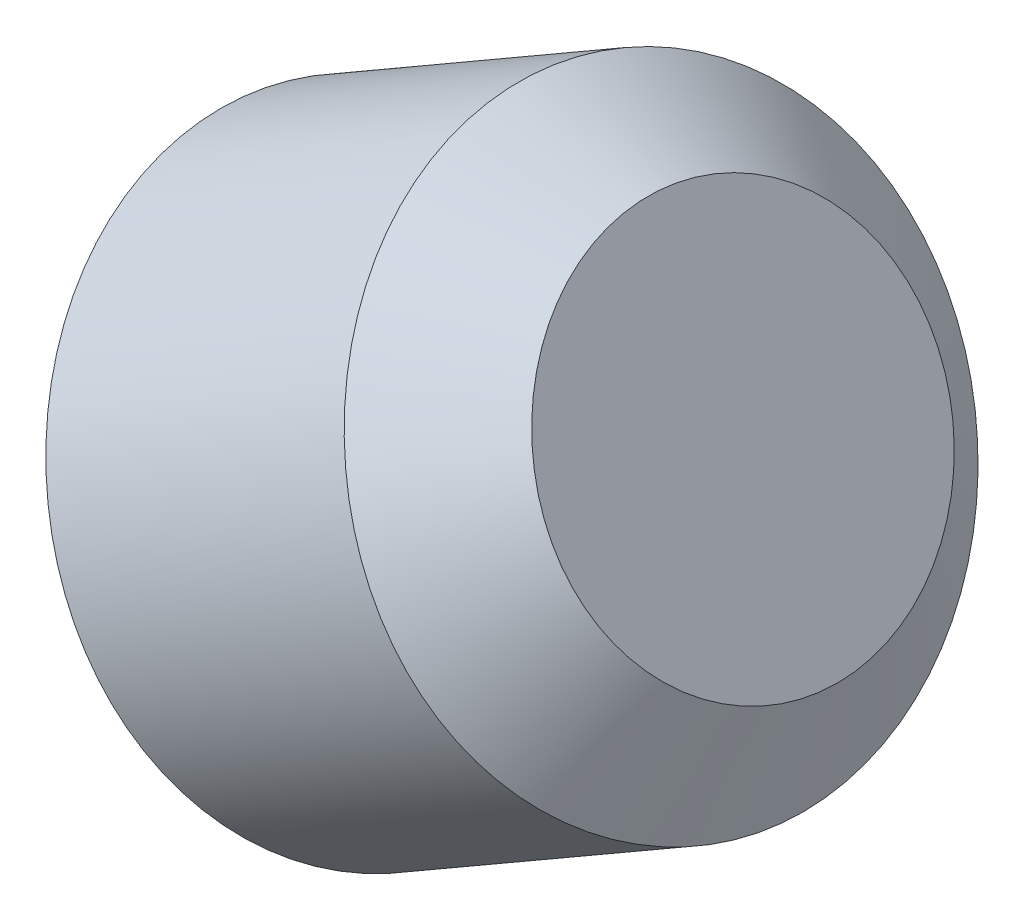
ISO-10303-21;
HEADER;
FILE_DESCRIPTION(('STEP AP214'),'2;1');
FILE_NAME('part.step','',(''),(''),'','','');
FILE_SCHEMA(('AUTOMOTIVE_DESIGN { 1 0 10303 214 1 1 1 1 }'));
ENDSEC;
DATA;
#1=APPLICATION_CONTEXT('core data for automotive mechanical design processes');
#2=APPLICATION_PROTOCOL_DEFINITION('international standard','automotive_design',2000,#1);
#3=PRODUCT_CONTEXT('',#1,'mechanical');
#4=PRODUCT('Part','Part','',(#3));
#5=PRODUCT_RELATED_PRODUCT_CATEGORY('part','',(#4));
#6=PRODUCT_DEFINITION_FORMATION('','',#4);
#7=PRODUCT_DEFINITION_CONTEXT('part definition',#1,'design');
#8=PRODUCT_DEFINITION('design','',#6,#7);
#9=PRODUCT_DEFINITION_SHAPE('','',#8);
#10=(LENGTH_UNIT() NAMED_UNIT(*) SI_UNIT(.MILLI.,.METRE.));
#11=(NAMED_UNIT(*) PLANE_ANGLE_UNIT() SI_UNIT($,.RADIAN.));
#12=(NAMED_UNIT(*) SI_UNIT($,.STERADIAN.) SOLID_ANGLE_UNIT());
#13=UNCERTAINTY_MEASURE_WITH_UNIT(LENGTH_MEASURE(1.E-05),#10,'distance_accuracy_value','');
#14=(GEOMETRIC_REPRESENTATION_CONTEXT(3) GLOBAL_UNCERTAINTY_ASSIGNED_CONTEXT((#13)) GLOBAL_UNIT_ASSIGNED_CONTEXT((#10,
#11,#12)) REPRESENTATION_CONTEXT('',''));
#15=CARTESIAN_POINT('',(0.,0.,0.));
#16=DIRECTION('',(0.,0.,1.));
#17=DIRECTION('',(1.,0.,0.));
#18=AXIS2_PLACEMENT_3D('',#15,#16,#17);
#19=CARTESIAN_POINT('',(-18.0705080756888,-8.70096189432334,19.0660254037844));
#20=DIRECTION('',(-0.5,0.866025403784439,0.));
#21=DIRECTION('',(-0.866025403784439,-0.5,0.));
#22=AXIS2_PLACEMENT_3D('',#19,#20,#21);
#23=PLANE('',#22);
#24=DIRECTION('',(0.866025403784441,0.5,0.));
#25=VECTOR('',#24,1.);
#26=CARTESIAN_POINT('',(-18.0705080756888,-8.70096189432334,17.3339745962156));
#27=LINE('',#26,#25);
#28=CARTESIAN_POINT('',(-18.0705080756938,-8.70096189432089,17.333974596213));
#29=VERTEX_POINT('',#28);
#30=CARTESIAN_POINT('',(-16.3384572681199,-7.70096189432334,17.3339745962156));
#31=VERTEX_POINT('',#30);
#32=EDGE_CURVE('E75',#29,#31,#27,.T.);
#33=ORIENTED_EDGE('',*,*,#32,.T.);
#34=DIRECTION('',(0.,0.,1.));
#35=VECTOR('',#34,1.);
#36=CARTESIAN_POINT('',(-16.3384572681199,-7.70096189432334,18.2));
#37=LINE('',#36,#35);
#38=CARTESIAN_POINT('',(-16.3384572681199,-7.70096189432332,19.0660254037844));
#39=VERTEX_POINT('',#38);
#40=EDGE_CURVE('E272',#31,#39,#37,.T.);
#41=ORIENTED_EDGE('',*,*,#40,.T.);
#42=DIRECTION('',(-0.866025403784441,-0.5,0.));
#43=VECTOR('',#42,1.);
#44=CARTESIAN_POINT('',(-16.3384572681199,-7.70096189432332,19.0660254037844));
#45=LINE('',#44,#43);
#46=CARTESIAN_POINT('',(-18.0705080756689,-8.70096189430647,19.0660254037871));
#47=VERTEX_POINT('',#46);
#48=EDGE_CURVE('E78',#39,#47,#45,.T.);
#49=ORIENTED_EDGE('',*,*,#48,.T.);
#50=CARTESIAN_POINT('',(-18.0705080756894,-8.70096189432366,17.3339745962134));
#51=CARTESIAN_POINT('',(-18.0527331897658,-8.69069955915088,17.4050666943716));
#52=CARTESIAN_POINT('',(-18.0364597802602,-8.68130410179218,17.4767211941388));
#53=CARTESIAN_POINT('',(-18.0076985481524,-8.66469879669252,17.6211941714046));
#54=CARTESIAN_POINT('',(-17.9952191955697,-8.65749383911956,17.6940148766805));
#55=CARTESIAN_POINT('',(-17.9751508858139,-8.64590739507989,17.838839173771));
#56=CARTESIAN_POINT('',(-17.9674549328141,-8.6414641345438,17.9108223754799));
#57=CARTESIAN_POINT('',(-17.9571235723808,-8.63549932081653,18.0552040758798));
#58=CARTESIAN_POINT('',(-17.9544826719044,-8.63397459621557,18.1276020379399));
#59=CARTESIAN_POINT('',(-17.9544826719044,-8.63397459621557,18.2723979620594));
#60=CARTESIAN_POINT('',(-17.9571235723807,-8.6354993208165,18.3447959241189));
#61=CARTESIAN_POINT('',(-17.9674549328139,-8.64146413454367,18.4891776245176));
#62=CARTESIAN_POINT('',(-17.9751508858135,-8.64590739507968,18.5611608262258));
#63=CARTESIAN_POINT('',(-17.995219195569,-8.65749383911916,18.705985123315));
#64=CARTESIAN_POINT('',(-18.0076985481515,-8.664698796692,18.7788058285904));
#65=CARTESIAN_POINT('',(-18.0364597802588,-8.68130410179139,18.9232788058549));
#66=CARTESIAN_POINT('',(-18.0527331897642,-8.69069955914994,18.9949333056215));
#67=CARTESIAN_POINT('',(-18.0705080756875,-8.70096189432257,19.066025403779));
#68=B_SPLINE_CURVE_WITH_KNOTS('',3,(#50,#51,#52,#53,#54,#55,#56,#57,#58,#59,#60,#61,#62,#63,#64,
#65,#66,#67),.UNSPECIFIED.,.F.,.F.,(4,2,2,2,2,2,2,2,4),(0.,0.222055046938493,0.444602239567093,
0.66197314437882,0.879107709995521,1.09624227561031,1.31361318042012,1.53616037304669,
1.75821541998318),.UNSPECIFIED.);
#69=EDGE_CURVE('E21',#29,#47,#68,.T.);
#70=ORIENTED_EDGE('',*,*,#69,.F.);
#71=EDGE_LOOP('',(#33,#41,#49,#70));
#72=FACE_BOUND('',#71,.T.);
#73=ADVANCED_FACE('F17',(#72),#23,.F.);
#74=CARTESIAN_POINT('',(-16.5705080756888,-11.2990381056767,17.3339745962156));
#75=DIRECTION('',(0.5,-0.866025403784439,0.));
#76=DIRECTION('',(0.866025403784439,0.5,0.));
#77=AXIS2_PLACEMENT_3D('',#74,#75,#76);
#78=PLANE('',#77);
#79=DIRECTION('',(0.866025403784441,0.5,0.));
#80=VECTOR('',#79,1.);
#81=CARTESIAN_POINT('',(-16.5705080756888,-11.2990381056767,19.0660254037844));
#82=LINE('',#81,#80);
#83=CARTESIAN_POINT('',(-16.5705080756871,-11.2990381056863,19.0660254037802));
#84=VERTEX_POINT('',#83);
#85=CARTESIAN_POINT('',(-14.8384572681199,-10.2990381056767,19.0660254037844));
#86=VERTEX_POINT('',#85);
#87=EDGE_CURVE('E235',#84,#86,#82,.T.);
#88=ORIENTED_EDGE('',*,*,#87,.T.);
#89=DIRECTION('',(0.,0.,1.));
#90=VECTOR('',#89,1.);
#91=CARTESIAN_POINT('',(-14.8384572681199,-10.2990381056767,18.2));
#92=LINE('',#91,#90);
#93=CARTESIAN_POINT('',(-14.8384572681199,-10.2990381056767,17.3339745962156));
#94=VERTEX_POINT('',#93);
#95=EDGE_CURVE('E172',#86,#94,#92,.F.);
#96=ORIENTED_EDGE('',*,*,#95,.T.);
#97=DIRECTION('',(-0.866025403784441,-0.5,0.));
#98=VECTOR('',#97,1.);
#99=CARTESIAN_POINT('',(-14.8384572681199,-10.2990381056767,17.3339745962156));
#100=LINE('',#99,#98);
#101=CARTESIAN_POINT('',(-16.5705080756944,-11.2990381056853,17.333974596213));
#102=VERTEX_POINT('',#101);
#103=EDGE_CURVE('E90',#94,#102,#100,.T.);
#104=ORIENTED_EDGE('',*,*,#103,.T.);
#105=CARTESIAN_POINT('',(-16.5705080756893,-11.299038105677,19.0660254037866));
#106=CARTESIAN_POINT('',(-16.5527331897658,-11.2887757705042,18.9949333056284));
#107=CARTESIAN_POINT('',(-16.5364597802602,-11.2793803131456,18.9232788058612));
#108=CARTESIAN_POINT('',(-16.5076985481524,-11.2627750080459,18.7788058285954));
#109=CARTESIAN_POINT('',(-16.4952191955697,-11.2555700504729,18.7059851233195));
#110=CARTESIAN_POINT('',(-16.4751508858139,-11.2439836064333,18.561160826229));
#111=CARTESIAN_POINT('',(-16.4674549328141,-11.2395403458972,18.4891776245201));
#112=CARTESIAN_POINT('',(-16.4571235723808,-11.2335755321699,18.3447959241202));
#113=CARTESIAN_POINT('',(-16.4544826719044,-11.2320508075689,18.2723979620601));
#114=CARTESIAN_POINT('',(-16.4544826719044,-11.2320508075689,18.1276020379399));
#115=CARTESIAN_POINT('',(-16.4571235723808,-11.2335755321699,18.0552040758797));
#116=CARTESIAN_POINT('',(-16.4674549328142,-11.2395403458972,17.9108223754797));
#117=CARTESIAN_POINT('',(-16.4751508858139,-11.2439836064333,17.8388391737707));
#118=CARTESIAN_POINT('',(-16.4952191955697,-11.255570050473,17.6940148766801));
#119=CARTESIAN_POINT('',(-16.5076985481525,-11.2627750080459,17.6211941714041));
#120=CARTESIAN_POINT('',(-16.5364597802603,-11.2793803131456,17.4767211941382));
#121=CARTESIAN_POINT('',(-16.552733189766,-11.2887757705043,17.4050666943709));
#122=CARTESIAN_POINT('',(-16.5705080756895,-11.2990381056771,17.3339745962127));
#123=B_SPLINE_CURVE_WITH_KNOTS('',3,(#105,#106,#107,#108,#109,#110,#111,#112,#113,#114,#115,
#116,#117,#118,#119,#120,#121,#122),.UNSPECIFIED.,.F.,.F.,(4,2,2,2,2,2,2,2,4),(0.,
0.222055046938501,0.444602239567101,0.661973144378821,0.879107709995511,1.09624227561238,
1.31361318042428,1.53616037305307,1.75821541999176),.UNSPECIFIED.);
#124=EDGE_CURVE('E79',#84,#102,#123,.T.);
#125=ORIENTED_EDGE('',*,*,#124,.F.);
#126=EDGE_LOOP('',(#88,#96,#104,#125));
#127=FACE_BOUND('',#126,.T.);
#128=ADVANCED_FACE('F164',(#127),#78,.F.);
#129=CARTESIAN_POINT('',(-15.5884572681199,-9.,18.2));
#130=DIRECTION('',(0.866025403784439,0.5,0.));
#131=DIRECTION('',(-0.5,0.866025403784439,0.));
#132=AXIS2_PLACEMENT_3D('',#129,#130,#131);
#133=PLANE('',#132);
#134=ORIENTED_EDGE('',*,*,#40,.F.);
#135=DIRECTION('',(0.433012701892218,-0.75,-0.5));
#136=VECTOR('',#135,1.);
#137=CARTESIAN_POINT('',(-16.3384572681199,-7.70096189432334,17.3339745962156));
#138=LINE('',#137,#136);
#139=CARTESIAN_POINT('',(-15.5884572681199,-9.,16.4679491924311));
#140=VERTEX_POINT('',#139);
#141=EDGE_CURVE('E89',#31,#140,#138,.T.);
#142=ORIENTED_EDGE('',*,*,#141,.T.);
#143=DIRECTION('',(0.433012701892208,-0.75,0.5));
#144=VECTOR('',#143,1.);
#145=CARTESIAN_POINT('',(-15.5884572681199,-9.,16.4679491924311));
#146=LINE('',#145,#144);
#147=EDGE_CURVE('E261',#140,#94,#146,.T.);
#148=ORIENTED_EDGE('',*,*,#147,.T.);
#149=ORIENTED_EDGE('',*,*,#95,.F.);
#150=DIRECTION('',(-0.433012701892208,0.75,0.5));
#151=VECTOR('',#150,1.);
#152=CARTESIAN_POINT('',(-14.8384572681199,-10.2990381056767,19.0660254037844));
#153=LINE('',#152,#151);
#154=CARTESIAN_POINT('',(-15.5884572681199,-9.,19.9320508075689));
#155=VERTEX_POINT('',#154);
#156=EDGE_CURVE('E237',#86,#155,#153,.T.);
#157=ORIENTED_EDGE('',*,*,#156,.T.);
#158=DIRECTION('',(-0.433012701892219,0.75,-0.5));
#159=VECTOR('',#158,1.);
#160=CARTESIAN_POINT('',(-15.5884572681199,-9.,19.9320508075689));
#161=LINE('',#160,#159);
#162=EDGE_CURVE('E243',#155,#39,#161,.T.);
#163=ORIENTED_EDGE('',*,*,#162,.T.);
#164=EDGE_LOOP('',(#134,#142,#148,#149,#157,#163));
#165=FACE_BOUND('',#164,.T.);
#166=ADVANCED_FACE('F161',(#165),#133,.F.);
#167=CARTESIAN_POINT('',(-17.3205080756888,-10.,16.4679491924311));
#168=DIRECTION('',(0.25,-0.433012701892219,-0.866025403784439));
#169=DIRECTION('',(0.,0.894427190999916,-0.447213595499958));
#170=AXIS2_PLACEMENT_3D('',#167,#168,#169);
#171=PLANE('',#170);
#172=ORIENTED_EDGE('',*,*,#103,.F.);
#173=ORIENTED_EDGE('',*,*,#147,.F.);
#174=DIRECTION('',(-0.866025403784441,-0.5,0.));
#175=VECTOR('',#174,1.);
#176=CARTESIAN_POINT('',(-15.5884572681199,-9.,16.4679491924311));
#177=LINE('',#176,#175);
#178=CARTESIAN_POINT('',(-17.3205080756914,-10.0000000000015,16.4679491924258));
#179=VERTEX_POINT('',#178);
#180=EDGE_CURVE('E253',#140,#179,#177,.T.);
#181=ORIENTED_EDGE('',*,*,#180,.T.);
#182=CARTESIAN_POINT('',(-17.3205080756908,-9.99999999999827,16.4679491924296));
#183=CARTESIAN_POINT('',(-17.2685163160813,-10.0460956869067,16.506005764087));
#184=CARTESIAN_POINT('',(-17.2179636190641,-10.0936792245604,16.5443908395294));
#185=CARTESIAN_POINT('',(-17.1206886318865,-10.1923870101073,16.6218256023191));
#186=CARTESIAN_POINT('',(-17.0739758381628,-10.2435194916068,16.6608766650843));
#187=CARTESIAN_POINT('',(-16.9866867290132,-10.348359471513,16.7384948503698));
#188=CARTESIAN_POINT('',(-16.9459871621013,-10.4019719322265,16.7770500336828));
#189=CARTESIAN_POINT('',(-16.8703258555111,-10.5128722302079,16.854341720537));
#190=CARTESIAN_POINT('',(-16.8353571323877,-10.5701554740989,16.8930779433368));
#191=CARTESIAN_POINT('',(-16.7756451530885,-10.6804297003362,16.9654524201165));
#192=CARTESIAN_POINT('',(-16.7501642018931,-10.733016495024,16.9991015344764));
#193=CARTESIAN_POINT('',(-16.7036698924987,-10.8403310244109,17.0661805501922));
#194=CARTESIAN_POINT('',(-16.6826606929908,-10.8950606964609,17.0996102197128));
#195=CARTESIAN_POINT('',(-16.6443017077694,-11.0073485356459,17.166827424527));
#196=CARTESIAN_POINT('',(-16.6270434013789,-11.064942512487,17.2006064568678));
#197=CARTESIAN_POINT('',(-16.5961966095231,-11.1812419011639,17.267660852997));
#198=CARTESIAN_POINT('',(-16.5826009882224,-11.2399449098866,17.3009370751672));
#199=CARTESIAN_POINT('',(-16.5705080756883,-11.2990381056793,17.333974596217));
#200=B_SPLINE_CURVE_WITH_KNOTS('',3,(#182,#183,#184,#185,#186,#187,#188,#189,#190,#191,#192,
#193,#194,#195,#196,#197,#198,#199),.UNSPECIFIED.,.F.,.F.,(4,2,2,2,2,2,2,2,4),(0.,
0.237762008667841,0.476095362770734,0.708530704615272,0.940680666674116,1.14278083697596,
1.34506814534913,1.55184121687119,1.75820848014227),.UNSPECIFIED.);
#201=EDGE_CURVE('E98',#179,#102,#200,.T.);
#202=ORIENTED_EDGE('',*,*,#201,.T.);
#203=EDGE_LOOP('',(#172,#173,#181,#202));
#204=FACE_BOUND('',#203,.T.);
#205=ADVANCED_FACE('F156',(#204),#171,.F.);
#206=CARTESIAN_POINT('',(-18.0705080756888,-8.70096189432334,17.3339745962156));
#207=DIRECTION('',(-0.25,0.433012701892219,-0.866025403784439));
#208=DIRECTION('',(0.,0.894427190999916,0.447213595499958));
#209=AXIS2_PLACEMENT_3D('',#206,#207,#208);
#210=PLANE('',#209);
#211=ORIENTED_EDGE('',*,*,#180,.F.);
#212=ORIENTED_EDGE('',*,*,#141,.F.);
#213=ORIENTED_EDGE('',*,*,#32,.F.);
#214=CARTESIAN_POINT('',(-18.0705080756903,-8.70096189432202,17.3339745962167));
#215=CARTESIAN_POINT('',(-18.0185163160808,-8.74705758123042,17.2959180245594));
#216=CARTESIAN_POINT('',(-17.9679636190636,-8.79464111888413,17.257532949117));
#217=CARTESIAN_POINT('',(-17.8706886318861,-8.89334890443107,17.1800981863273));
#218=CARTESIAN_POINT('',(-17.8239758381624,-8.94448138593057,17.1410471235621));
#219=CARTESIAN_POINT('',(-17.7366867290129,-9.04932136583673,17.0634289382766));
#220=CARTESIAN_POINT('',(-17.695987162101,-9.10293382655021,17.0248737549636));
#221=CARTESIAN_POINT('',(-17.6203258555108,-9.21383412453159,16.9475820681094));
#222=CARTESIAN_POINT('',(-17.5853571323874,-9.27111736842262,16.9088458453097));
#223=CARTESIAN_POINT('',(-17.5256451530883,-9.38139159465989,16.8364713685299));
#224=CARTESIAN_POINT('',(-17.5001642018929,-9.43397838934767,16.8028222541701));
#225=CARTESIAN_POINT('',(-17.4536698924986,-9.54129291873448,16.7357432384544));
#226=CARTESIAN_POINT('',(-17.4326606929906,-9.59602259078445,16.7023135689337));
#227=CARTESIAN_POINT('',(-17.3943017077693,-9.70831042996937,16.6350963641196));
#228=CARTESIAN_POINT('',(-17.3770434013788,-9.76590440681046,16.6013173317789));
#229=CARTESIAN_POINT('',(-17.346196609523,-9.88220379548734,16.5342629356496));
#230=CARTESIAN_POINT('',(-17.3326009882224,-9.94090680421,16.5009867134794));
#231=CARTESIAN_POINT('',(-17.3205080756882,-10.0000000000026,16.4679491924297));
#232=B_SPLINE_CURVE_WITH_KNOTS('',3,(#214,#215,#216,#217,#218,#219,#220,#221,#222,#223,#224,
#225,#226,#227,#228,#229,#230,#231),.UNSPECIFIED.,.F.,.F.,(4,2,2,2,2,2,2,2,4),(0.,
0.237762008667789,0.476095362770627,0.708530704615115,0.940680666673917,1.14278083697563,
1.34506814534869,1.55184121687061,1.75820848014155),.UNSPECIFIED.);
#233=EDGE_CURVE('E86',#29,#179,#232,.T.);
#234=ORIENTED_EDGE('',*,*,#233,.T.);
#235=EDGE_LOOP('',(#211,#212,#213,#234));
#236=FACE_BOUND('',#235,.T.);
#237=ADVANCED_FACE('F85',(#236),#210,.F.);
#238=CARTESIAN_POINT('',(-17.3205080756888,-10.,19.9320508075689));
#239=DIRECTION('',(-0.25,0.433012701892219,0.866025403784439));
#240=DIRECTION('',(0.,-0.894427190999916,0.447213595499958));
#241=AXIS2_PLACEMENT_3D('',#238,#239,#240);
#242=PLANE('',#241);
#243=ORIENTED_EDGE('',*,*,#48,.F.);
#244=ORIENTED_EDGE('',*,*,#162,.F.);
#245=DIRECTION('',(-0.866025403784441,-0.5,0.));
#246=VECTOR('',#245,1.);
#247=CARTESIAN_POINT('',(-15.5884572681199,-9.,19.9320508075688));
#248=LINE('',#247,#246);
#249=CARTESIAN_POINT('',(-17.3205080756915,-10.0000000000015,19.9320508075742));
#250=VERTEX_POINT('',#249);
#251=EDGE_CURVE('E40',#155,#250,#248,.T.);
#252=ORIENTED_EDGE('',*,*,#251,.T.);
#253=CARTESIAN_POINT('',(-17.3205080756883,-10.0000000000026,19.9320508075704));
#254=CARTESIAN_POINT('',(-17.3344322317511,-9.93192597193912,19.8939942359131));
#255=CARTESIAN_POINT('',(-17.3503644356525,-9.86435428326551,19.8556091604706));
#256=CARTESIAN_POINT('',(-17.3872103918987,-9.73075778044345,19.7781743976809));
#257=CARTESIAN_POINT('',(-17.408136022974,-9.66473707364725,19.7391233349157));
#258=CARTESIAN_POINT('',(-17.4552855543302,-9.53672249769692,19.6615051496302));
#259=CARTESIAN_POINT('',(-17.4813655238115,-9.47466940847147,19.6229499663172));
#260=CARTESIAN_POINT('',(-17.5395773458555,-9.35369464589009,19.545658279463));
#261=CARTESIAN_POINT('',(-17.5717017287146,-9.29476922138179,19.5069220566632));
#262=CARTESIAN_POINT('',(-17.6373460203689,-9.18792001728032,19.4345475798838));
#263=CARTESIAN_POINT('',(-17.6701470448741,-9.1395594688891,19.4008984655243));
#264=CARTESIAN_POINT('',(-17.7398369988203,-9.04563695112961,19.3338194498092));
#265=CARTESIAN_POINT('',(-17.7767296854019,-9.00007761461798,19.3003897802889));
#266=CARTESIAN_POINT('',(-17.8547943140606,-8.91071383936124,19.2331725754754));
#267=CARTESIAN_POINT('',(-17.8960430079142,-8.86697071918061,19.199393543135));
#268=CARTESIAN_POINT('',(-17.981337837024,-8.78210691947046,19.1323391470064));
#269=CARTESIAN_POINT('',(-18.0253783232056,-8.7409812616829,19.0990629248366));
#270=CARTESIAN_POINT('',(-18.0705080756852,-8.70096189432659,19.0660254037872));
#271=B_SPLINE_CURVE_WITH_KNOTS('',3,(#253,#254,#255,#256,#257,#258,#259,#260,#261,#262,#263,
#264,#265,#266,#267,#268,#269,#270),.UNSPECIFIED.,.F.,.F.,(4,2,2,2,2,2,2,2,4),(0.,
0.237762008667832,0.47609536277072,0.708530704615269,0.940680666674129,1.14278083697387,
1.34506814534494,1.55184121686478,1.75820848013365),.UNSPECIFIED.);
#272=EDGE_CURVE('E97',#250,#47,#271,.T.);
#273=ORIENTED_EDGE('',*,*,#272,.T.);
#274=EDGE_LOOP('',(#243,#244,#252,#273));
#275=FACE_BOUND('',#274,.T.);
#276=ADVANCED_FACE('F155',(#275),#242,.F.);
#277=CARTESIAN_POINT('',(-16.5705080756888,-11.2990381056767,19.0660254037844));
#278=DIRECTION('',(0.25,-0.433012701892219,0.866025403784439));
#279=DIRECTION('',(0.,-0.894427190999916,-0.447213595499958));
#280=AXIS2_PLACEMENT_3D('',#277,#278,#279);
#281=PLANE('',#280);
#282=ORIENTED_EDGE('',*,*,#251,.F.);
#283=ORIENTED_EDGE('',*,*,#156,.F.);
#284=ORIENTED_EDGE('',*,*,#87,.F.);
#285=CARTESIAN_POINT('',(-16.5705080756884,-11.2990381056786,19.0660254037833));
#286=CARTESIAN_POINT('',(-16.5844322317513,-11.2309640776152,19.1040819754406));
#287=CARTESIAN_POINT('',(-16.6003644356527,-11.1633923889416,19.142467050883));
#288=CARTESIAN_POINT('',(-16.6372103918989,-11.0297958861196,19.2199018136727));
#289=CARTESIAN_POINT('',(-16.6581360229741,-10.9637751793234,19.2589528764379));
#290=CARTESIAN_POINT('',(-16.7052855543304,-10.8357606033731,19.3365710617234));
#291=CARTESIAN_POINT('',(-16.7313655238117,-10.7737075141477,19.3751262450364));
#292=CARTESIAN_POINT('',(-16.7895773458557,-10.6527327515663,19.4524179318906));
#293=CARTESIAN_POINT('',(-16.8217017287148,-10.593807327058,19.4911541546904));
#294=CARTESIAN_POINT('',(-16.8873460203694,-10.4869581229561,19.5635286314701));
#295=CARTESIAN_POINT('',(-16.920147044875,-10.4385975745644,19.5971777458299));
#296=CARTESIAN_POINT('',(-16.9898369988219,-10.3446750568041,19.6642567615457));
#297=CARTESIAN_POINT('',(-17.026729685404,-10.2991157202921,19.6976864310663));
#298=CARTESIAN_POINT('',(-17.1047943140636,-10.2097519450346,19.7649036358805));
#299=CARTESIAN_POINT('',(-17.1460430079177,-10.1660088248536,19.7986826682212));
#300=CARTESIAN_POINT('',(-17.2313378370285,-10.0811450251427,19.8657370643504));
#301=CARTESIAN_POINT('',(-17.2753783232107,-10.0400193673549,19.8990132865206));
#302=CARTESIAN_POINT('',(-17.3205080756908,-9.99999999999823,19.9320508075703));
#303=B_SPLINE_CURVE_WITH_KNOTS('',3,(#285,#286,#287,#288,#289,#290,#291,#292,#293,#294,#295,
#296,#297,#298,#299,#300,#301,#302),.UNSPECIFIED.,.F.,.F.,(4,2,2,2,2,2,2,2,4),(0.,
0.237762008667789,0.476095362770637,0.708530704615136,0.94068066667394,1.14278083697565,
1.3450681453487,1.55184121687062,1.75820848014155),.UNSPECIFIED.);
#304=EDGE_CURVE('E111',#84,#250,#303,.T.);
#305=ORIENTED_EDGE('',*,*,#304,.T.);
#306=EDGE_LOOP('',(#282,#283,#284,#305));
#307=FACE_BOUND('',#306,.T.);
#308=ADVANCED_FACE('F123',(#307),#281,.F.);
#309=CARTESIAN_POINT('',(-17.3205080756941,-10.0000000000031,18.2));
#310=DIRECTION('',(-0.866025403784439,-0.5,0.));
#311=DIRECTION('',(0.5,-0.866025403784439,0.));
#312=AXIS2_PLACEMENT_3D('',#309,#310,#311);
#313=CONICAL_SURFACE('',#312,1.73205080757951,1.0471975511966);
#314=ORIENTED_EDGE('',*,*,#124,.T.);
#315=CARTESIAN_POINT('',(-17.3205080756994,-10.0000000000061,18.2));
#316=DIRECTION('',(-0.866025403784439,-0.5,0.));
#317=DIRECTION('',(0.5,-0.866025403784439,0.));
#318=AXIS2_PLACEMENT_3D('',#315,#316,#317);
#319=CIRCLE('',#318,1.73205080759004);
#320=EDGE_CURVE('E106',#84,#102,#319,.F.);
#321=ORIENTED_EDGE('',*,*,#320,.F.);
#322=EDGE_LOOP('',(#314,#321));
#323=FACE_BOUND('',#322,.T.);
#324=ADVANCED_FACE('F173',(#323),#313,.F.);
#325=CARTESIAN_POINT('',(-17.3205080756941,-10.0000000000031,18.2));
#326=DIRECTION('',(-0.866025403784439,-0.5,0.));
#327=DIRECTION('',(0.5,-0.866025403784439,0.));
#328=AXIS2_PLACEMENT_3D('',#325,#326,#327);
#329=CONICAL_SURFACE('',#328,1.73205080757951,1.0471975511966);
#330=CARTESIAN_POINT('',(-17.3205080756941,-10.0000000000031,18.2));
#331=DIRECTION('',(-0.866025403784439,-0.5,0.));
#332=DIRECTION('',(0.5,-0.866025403784439,0.));
#333=AXIS2_PLACEMENT_3D('',#330,#331,#332);
#334=CIRCLE('',#333,1.73205080757951);
#335=EDGE_CURVE('E104',#102,#179,#334,.F.);
#336=ORIENTED_EDGE('',*,*,#335,.F.);
#337=ORIENTED_EDGE('',*,*,#201,.F.);
#338=EDGE_LOOP('',(#336,#337));
#339=FACE_BOUND('',#338,.T.);
#340=ADVANCED_FACE('F142',(#339),#329,.F.);
#341=CARTESIAN_POINT('',(-17.3205080756941,-10.0000000000031,18.2));
#342=DIRECTION('',(-0.866025403784439,-0.5,0.));
#343=DIRECTION('',(0.5,-0.866025403784439,0.));
#344=AXIS2_PLACEMENT_3D('',#341,#342,#343);
#345=CONICAL_SURFACE('',#344,1.73205080757951,1.0471975511966);
#346=CARTESIAN_POINT('',(-17.3205080756941,-10.0000000000031,18.2));
#347=DIRECTION('',(-0.866025403784439,-0.5,0.));
#348=DIRECTION('',(0.5,-0.866025403784439,0.));
#349=AXIS2_PLACEMENT_3D('',#346,#347,#348);
#350=CIRCLE('',#349,1.73205080757951);
#351=EDGE_CURVE('E68',#179,#29,#350,.F.);
#352=ORIENTED_EDGE('',*,*,#351,.F.);
#353=ORIENTED_EDGE('',*,*,#233,.F.);
#354=EDGE_LOOP('',(#352,#353));
#355=FACE_BOUND('',#354,.T.);
#356=ADVANCED_FACE('F94',(#355),#345,.F.);
#357=CARTESIAN_POINT('',(-17.3205080756941,-10.0000000000031,18.2));
#358=DIRECTION('',(-0.866025403784439,-0.5,0.));
#359=DIRECTION('',(0.5,-0.866025403784439,0.));
#360=AXIS2_PLACEMENT_3D('',#357,#358,#359);
#361=CONICAL_SURFACE('',#360,1.73205080757951,1.0471975511966);
#362=ORIENTED_EDGE('',*,*,#69,.T.);
#363=CARTESIAN_POINT('',(-17.3205080756389,-9.99999999997118,18.2));
#364=DIRECTION('',(-0.866025403784439,-0.5,0.));
#365=DIRECTION('',(0.5,-0.866025403784439,0.));
#366=AXIS2_PLACEMENT_3D('',#363,#364,#365);
#367=CIRCLE('',#366,1.73205080746903);
#368=EDGE_CURVE('E60',#29,#47,#367,.F.);
#369=ORIENTED_EDGE('',*,*,#368,.F.);
#370=EDGE_LOOP('',(#362,#369));
#371=FACE_BOUND('',#370,.T.);
#372=ADVANCED_FACE('F62',(#371),#361,.F.);
#373=CARTESIAN_POINT('',(-17.3205080756941,-10.0000000000031,18.2));
#374=DIRECTION('',(-0.866025403784439,-0.5,0.));
#375=DIRECTION('',(0.5,-0.866025403784439,0.));
#376=AXIS2_PLACEMENT_3D('',#373,#374,#375);
#377=CONICAL_SURFACE('',#376,1.73205080757951,1.0471975511966);
#378=CARTESIAN_POINT('',(-17.3205080756941,-10.0000000000031,18.2));
#379=DIRECTION('',(-0.866025403784439,-0.5,0.));
#380=DIRECTION('',(0.5,-0.866025403784439,0.));
#381=AXIS2_PLACEMENT_3D('',#378,#379,#380);
#382=CIRCLE('',#381,1.73205080757951);
#383=EDGE_CURVE('E67',#47,#250,#382,.F.);
#384=ORIENTED_EDGE('',*,*,#383,.F.);
#385=ORIENTED_EDGE('',*,*,#272,.F.);
#386=EDGE_LOOP('',(#384,#385));
#387=FACE_BOUND('',#386,.T.);
#388=ADVANCED_FACE('F130',(#387),#377,.F.);
#389=CARTESIAN_POINT('',(-17.3205080756941,-10.0000000000031,18.2));
#390=DIRECTION('',(-0.866025403784439,-0.5,0.));
#391=DIRECTION('',(0.5,-0.866025403784439,0.));
#392=AXIS2_PLACEMENT_3D('',#389,#390,#391);
#393=CONICAL_SURFACE('',#392,1.73205080757951,1.0471975511966);
#394=CARTESIAN_POINT('',(-17.3205080756941,-10.0000000000031,18.2));
#395=DIRECTION('',(-0.866025403784439,-0.5,0.));
#396=DIRECTION('',(0.5,-0.866025403784439,0.));
#397=AXIS2_PLACEMENT_3D('',#394,#395,#396);
#398=CIRCLE('',#397,1.73205080757951);
#399=EDGE_CURVE('E221',#250,#84,#398,.F.);
#400=ORIENTED_EDGE('',*,*,#399,.F.);
#401=ORIENTED_EDGE('',*,*,#304,.F.);
#402=EDGE_LOOP('',(#400,#401));
#403=FACE_BOUND('',#402,.T.);
#404=ADVANCED_FACE('F126',(#403),#393,.F.);
#405=CARTESIAN_POINT('',(-16.2908703737966,-11.7833848130658,18.2));
#406=DIRECTION('',(-0.866025403784439,-0.5,0.));
#407=DIRECTION('',(0.5,-0.866025403784439,0.));
#408=AXIS2_PLACEMENT_3D('',#405,#406,#407);
#409=PLANE('',#408);
#410=ORIENTED_EDGE('',*,*,#383,.T.);
#411=ORIENTED_EDGE('',*,*,#399,.T.);
#412=ORIENTED_EDGE('',*,*,#320,.T.);
#413=ORIENTED_EDGE('',*,*,#335,.T.);
#414=ORIENTED_EDGE('',*,*,#351,.T.);
#415=ORIENTED_EDGE('',*,*,#368,.T.);
#416=EDGE_LOOP('',(#410,#411,#412,#413,#414,#415));
#417=FACE_BOUND('',#416,.T.);
#418=CARTESIAN_POINT('',(-17.3205080757496,-10.0000000000351,18.2));
#419=DIRECTION('',(0.866025403784439,0.5,0.));
#420=DIRECTION('',(-0.5,0.866025403784439,0.));
#421=AXIS2_PLACEMENT_3D('',#418,#419,#420);
#422=CIRCLE('',#421,2.38649999994374);
#423=CARTESIAN_POINT('',(-18.5137580757214,-7.93323037395222,18.2));
#424=VERTEX_POINT('',#423);
#425=EDGE_CURVE('E213',#424,#424,#422,.T.);
#426=ORIENTED_EDGE('',*,*,#425,.F.);
#427=EDGE_LOOP('',(#426));
#428=FACE_BOUND('',#427,.T.);
#429=ADVANCED_FACE('F100',(#417,#428),#409,.T.);
#430=CARTESIAN_POINT('',(-12.4903810567666,-8.36602540378444,18.2));
#431=DIRECTION('',(0.866025403784439,0.5,0.));
#432=DIRECTION('',(-0.5,0.866025403784439,0.));
#433=AXIS2_PLACEMENT_3D('',#430,#431,#432);
#434=PLANE('',#433);
#435=CARTESIAN_POINT('',(-12.9903810568106,-7.5000000000254,18.2));
#436=DIRECTION('',(-0.866025403784439,-0.5,0.));
#437=DIRECTION('',(0.5,-0.866025403784439,0.));
#438=AXIS2_PLACEMENT_3D('',#435,#436,#437);
#439=CIRCLE('',#438,2.00000000001007);
#440=CARTESIAN_POINT('',(-11.9903810568055,-9.232050807603,18.2));
#441=VERTEX_POINT('',#440);
#442=EDGE_CURVE('E211',#441,#441,#439,.T.);
#443=ORIENTED_EDGE('',*,*,#442,.F.);
#444=EDGE_LOOP('',(#443));
#445=FACE_BOUND('',#444,.T.);
#446=ADVANCED_FACE('F201',(#445),#434,.T.);
#447=CARTESIAN_POINT('',(-17.0137580757254,-9.8228978049472,18.2));
#448=DIRECTION('',(0.866025403784439,0.5,0.));
#449=DIRECTION('',(-0.5,0.866025403784439,0.));
#450=AXIS2_PLACEMENT_3D('',#447,#448,#449);
#451=CONICAL_SURFACE('',#450,3.00000000002523,1.04719755122001);
#452=ORIENTED_EDGE('',*,*,#425,.T.);
#453=EDGE_LOOP('',(#452));
#454=FACE_BOUND('',#453,.T.);
#455=CARTESIAN_POINT('',(-17.0137580756888,-9.82289780492609,18.2));
#456=DIRECTION('',(-0.866025403784439,-0.5,0.));
#457=DIRECTION('',(0.5,-0.866025403784439,0.));
#458=AXIS2_PLACEMENT_3D('',#455,#456,#457);
#459=CIRCLE('',#458,3.);
#460=CARTESIAN_POINT('',(-15.5137580756888,-12.4209740162794,18.2));
#461=VERTEX_POINT('',#460);
#462=EDGE_CURVE('E32',#461,#461,#459,.F.);
#463=ORIENTED_EDGE('',*,*,#462,.F.);
#464=EDGE_LOOP('',(#463));
#465=FACE_BOUND('',#464,.T.);
#466=ADVANCED_FACE('F194',(#454,#465),#451,.T.);
#467=CARTESIAN_POINT('',(-13.8564064604825,-7.99999999996043,18.2));
#468=DIRECTION('',(-0.866025403784439,-0.5,0.));
#469=DIRECTION('',(0.5,-0.866025403784439,0.));
#470=AXIS2_PLACEMENT_3D('',#467,#468,#469);
#471=CONICAL_SURFACE('',#470,2.99999999991264,0.785398163413708);
#472=ORIENTED_EDGE('',*,*,#442,.T.);
#473=EDGE_LOOP('',(#472));
#474=FACE_BOUND('',#473,.T.);
#475=CARTESIAN_POINT('',(-13.856406460551,-8.,18.2));
#476=DIRECTION('',(-0.866025403784439,-0.5,0.));
#477=DIRECTION('',(0.5,-0.866025403784439,0.));
#478=AXIS2_PLACEMENT_3D('',#475,#476,#477);
#479=CIRCLE('',#478,3.);
#480=CARTESIAN_POINT('',(-12.356406460551,-10.5980762113533,18.2));
#481=VERTEX_POINT('',#480);
#482=EDGE_CURVE('E11',#481,#481,#479,.T.);
#483=ORIENTED_EDGE('',*,*,#482,.F.);
#484=EDGE_LOOP('',(#483));
#485=FACE_BOUND('',#484,.T.);
#486=ADVANCED_FACE('F187',(#474,#485),#471,.T.);
#487=CARTESIAN_POINT('',(-15.4350822681199,-8.91144890246304,18.2));
#488=DIRECTION('',(-0.866025403784439,-0.5,0.));
#489=DIRECTION('',(0.5,-0.866025403784439,0.));
#490=AXIS2_PLACEMENT_3D('',#487,#488,#489);
#491=CYLINDRICAL_SURFACE('',#490,3.);
#492=ORIENTED_EDGE('',*,*,#462,.T.);
#493=EDGE_LOOP('',(#492));
#494=FACE_BOUND('',#493,.T.);
#495=ORIENTED_EDGE('',*,*,#482,.T.);
#496=EDGE_LOOP('',(#495));
#497=FACE_BOUND('',#496,.T.);
#498=ADVANCED_FACE('F185',(#494,#497),#491,.T.);
#499=CLOSED_SHELL('',(#73,#128,#166,#205,#237,#276,#308,#324,#340,#356,#372,#388,#404,#429,#446,
#466,#486,#498));
#500=MANIFOLD_SOLID_BREP('B1',#499);
#501=ADVANCED_BREP_SHAPE_REPRESENTATION('',(#18,#500),#14);
#502=SHAPE_DEFINITION_REPRESENTATION(#9,#501);
ENDSEC;
END-ISO-10303-21;
